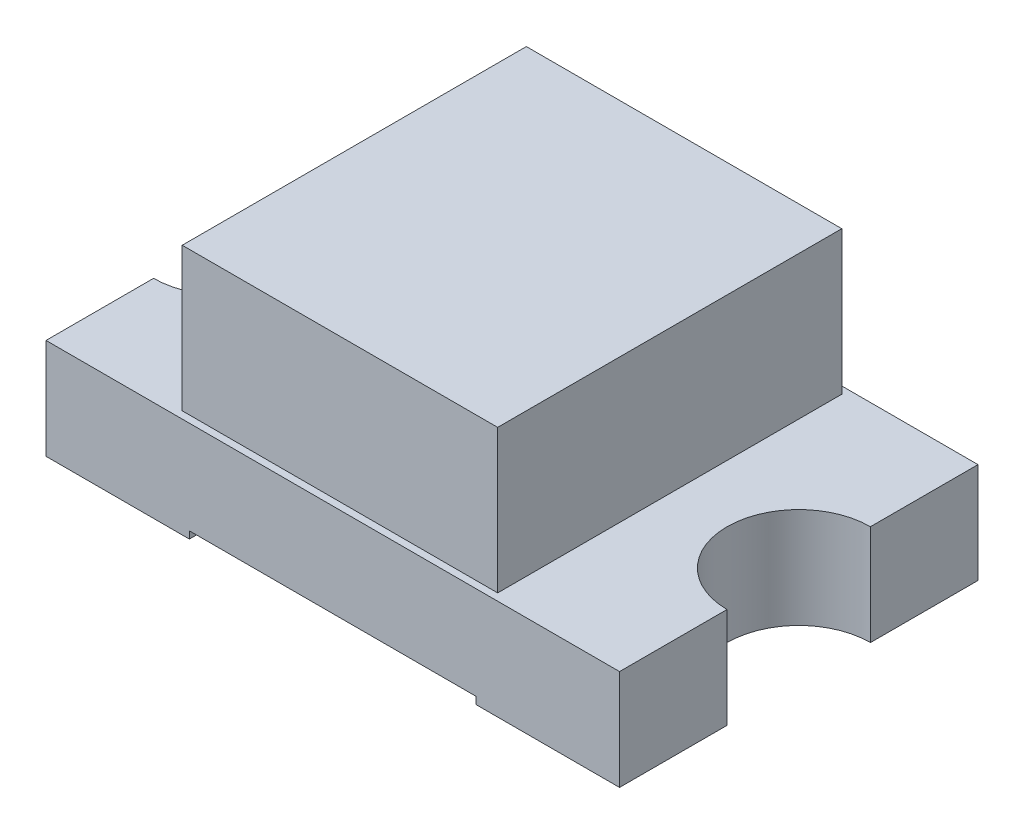
ISO-10303-21;
HEADER;
FILE_DESCRIPTION(('STEP AP214'),'2;1');
FILE_NAME('part.step','',(''),(''),'','','');
FILE_SCHEMA(('AUTOMOTIVE_DESIGN { 1 0 10303 214 1 1 1 1 }'));
ENDSEC;
DATA;
#1=APPLICATION_CONTEXT('core data for automotive mechanical design processes');
#2=APPLICATION_PROTOCOL_DEFINITION('international standard','automotive_design',2000,#1);
#3=PRODUCT_CONTEXT('',#1,'mechanical');
#4=PRODUCT('Part','Part','',(#3));
#5=PRODUCT_RELATED_PRODUCT_CATEGORY('part','',(#4));
#6=PRODUCT_DEFINITION_FORMATION('','',#4);
#7=PRODUCT_DEFINITION_CONTEXT('part definition',#1,'design');
#8=PRODUCT_DEFINITION('design','',#6,#7);
#9=PRODUCT_DEFINITION_SHAPE('','',#8);
#10=(LENGTH_UNIT() NAMED_UNIT(*) SI_UNIT(.MILLI.,.METRE.));
#11=(NAMED_UNIT(*) PLANE_ANGLE_UNIT() SI_UNIT($,.RADIAN.));
#12=(NAMED_UNIT(*) SI_UNIT($,.STERADIAN.) SOLID_ANGLE_UNIT());
#13=UNCERTAINTY_MEASURE_WITH_UNIT(LENGTH_MEASURE(1.E-05),#10,'distance_accuracy_value','');
#14=(GEOMETRIC_REPRESENTATION_CONTEXT(3) GLOBAL_UNCERTAINTY_ASSIGNED_CONTEXT((#13)) GLOBAL_UNIT_ASSIGNED_CONTEXT((#10,
#11,#12)) REPRESENTATION_CONTEXT('',''));
#15=CARTESIAN_POINT('',(0.,0.,0.));
#16=DIRECTION('',(0.,0.,1.));
#17=DIRECTION('',(1.,0.,0.));
#18=AXIS2_PLACEMENT_3D('',#15,#16,#17);
#19=CARTESIAN_POINT('',(0.,0.3302,0.));
#20=DIRECTION('',(0.,1.,0.));
#21=DIRECTION('',(0.,0.,1.));
#22=AXIS2_PLACEMENT_3D('',#19,#20,#21);
#23=PLANE('',#22);
#24=CARTESIAN_POINT('',(0.,0.3302,-0.635));
#25=DIRECTION('',(0.,1.,0.));
#26=DIRECTION('',(0.,0.,1.));
#27=AXIS2_PLACEMENT_3D('',#24,#25,#26);
#28=CIRCLE('',#27,0.254);
#29=CARTESIAN_POINT('',(0.,0.3302,-0.889));
#30=VERTEX_POINT('',#29);
#31=CARTESIAN_POINT('',(0.,0.3302,-0.381));
#32=VERTEX_POINT('',#31);
#33=EDGE_CURVE('E278',#30,#32,#28,.T.);
#34=ORIENTED_EDGE('',*,*,#33,.F.);
#35=DIRECTION('',(0.,0.,1.));
#36=VECTOR('',#35,1.);
#37=CARTESIAN_POINT('',(0.,0.3302,0.));
#38=LINE('',#37,#36);
#39=CARTESIAN_POINT('',(0.,0.3302,-1.27));
#40=VERTEX_POINT('',#39);
#41=EDGE_CURVE('E301',#40,#30,#38,.T.);
#42=ORIENTED_EDGE('',*,*,#41,.F.);
#43=DIRECTION('',(1.,0.,0.));
#44=VECTOR('',#43,1.);
#45=CARTESIAN_POINT('',(0.,0.3302,-1.27));
#46=LINE('',#45,#44);
#47=CARTESIAN_POINT('',(-2.032,0.3302,-1.27));
#48=VERTEX_POINT('',#47);
#49=EDGE_CURVE('E325',#48,#40,#46,.T.);
#50=ORIENTED_EDGE('',*,*,#49,.F.);
#51=DIRECTION('',(0.,0.,1.));
#52=VECTOR('',#51,1.);
#53=CARTESIAN_POINT('',(-2.032,0.3302,0.));
#54=LINE('',#53,#52);
#55=CARTESIAN_POINT('',(-2.032,0.3302,-0.889));
#56=VERTEX_POINT('',#55);
#57=EDGE_CURVE('E348',#48,#56,#54,.T.);
#58=ORIENTED_EDGE('',*,*,#57,.T.);
#59=CARTESIAN_POINT('',(-2.032,0.3302,-0.635));
#60=DIRECTION('',(0.,1.,0.));
#61=DIRECTION('',(0.,0.,1.));
#62=AXIS2_PLACEMENT_3D('',#59,#60,#61);
#63=CIRCLE('',#62,0.254);
#64=CARTESIAN_POINT('',(-2.032,0.3302,-0.381));
#65=VERTEX_POINT('',#64);
#66=EDGE_CURVE('E349',#65,#56,#63,.T.);
#67=ORIENTED_EDGE('',*,*,#66,.F.);
#68=CARTESIAN_POINT('',(-2.032,0.3302,0.));
#69=VERTEX_POINT('',#68);
#70=EDGE_CURVE('E346',#65,#69,#54,.T.);
#71=ORIENTED_EDGE('',*,*,#70,.T.);
#72=DIRECTION('',(1.,0.,0.));
#73=VECTOR('',#72,1.);
#74=CARTESIAN_POINT('',(0.,0.3302,0.));
#75=LINE('',#74,#73);
#76=CARTESIAN_POINT('',(0.,0.3302,0.));
#77=VERTEX_POINT('',#76);
#78=EDGE_CURVE('E343',#69,#77,#75,.T.);
#79=ORIENTED_EDGE('',*,*,#78,.T.);
#80=EDGE_CURVE('E311',#32,#77,#38,.T.);
#81=ORIENTED_EDGE('',*,*,#80,.F.);
#82=EDGE_LOOP('',(#34,#42,#50,#58,#67,#71,#79,#81));
#83=FACE_BOUND('',#82,.T.);
#84=DIRECTION('',(1.,0.,0.));
#85=VECTOR('',#84,1.);
#86=CARTESIAN_POINT('',(0.,0.3302,-0.0254));
#87=LINE('',#86,#85);
#88=CARTESIAN_POINT('',(-1.5748,0.3302,-0.0254));
#89=VERTEX_POINT('',#88);
#90=CARTESIAN_POINT('',(-0.4572,0.3302,-0.0254));
#91=VERTEX_POINT('',#90);
#92=EDGE_CURVE('E54',#89,#91,#87,.T.);
#93=ORIENTED_EDGE('',*,*,#92,.F.);
#94=DIRECTION('',(0.,0.,1.));
#95=VECTOR('',#94,1.);
#96=CARTESIAN_POINT('',(-1.5748,0.3302,0.));
#97=LINE('',#96,#95);
#98=CARTESIAN_POINT('',(-1.5748,0.3302,-1.2446));
#99=VERTEX_POINT('',#98);
#100=EDGE_CURVE('E196',#99,#89,#97,.T.);
#101=ORIENTED_EDGE('',*,*,#100,.F.);
#102=DIRECTION('',(1.,0.,0.));
#103=VECTOR('',#102,1.);
#104=CARTESIAN_POINT('',(0.,0.3302,-1.2446));
#105=LINE('',#104,#103);
#106=CARTESIAN_POINT('',(-0.4572,0.3302,-1.2446));
#107=VERTEX_POINT('',#106);
#108=EDGE_CURVE('E193',#99,#107,#105,.T.);
#109=ORIENTED_EDGE('',*,*,#108,.T.);
#110=DIRECTION('',(0.,0.,1.));
#111=VECTOR('',#110,1.);
#112=CARTESIAN_POINT('',(-0.4572,0.3302,0.));
#113=LINE('',#112,#111);
#114=EDGE_CURVE('E59',#107,#91,#113,.T.);
#115=ORIENTED_EDGE('',*,*,#114,.T.);
#116=EDGE_LOOP('',(#93,#101,#109,#115));
#117=FACE_BOUND('',#116,.T.);
#118=ADVANCED_FACE('F37',(#83,#117),#23,.T.);
#119=CARTESIAN_POINT('',(0.,0.,0.));
#120=DIRECTION('',(0.,1.,0.));
#121=DIRECTION('',(0.,0.,1.));
#122=AXIS2_PLACEMENT_3D('',#119,#120,#121);
#123=PLANE('',#122);
#124=DIRECTION('',(0.,0.,-1.));
#125=VECTOR('',#124,1.);
#126=CARTESIAN_POINT('',(-0.508,0.,0.));
#127=LINE('',#126,#125);
#128=CARTESIAN_POINT('',(-0.508,0.,-0.8509));
#129=VERTEX_POINT('',#128);
#130=CARTESIAN_POINT('',(-0.508,0.,-1.27));
#131=VERTEX_POINT('',#130);
#132=EDGE_CURVE('E236',#129,#131,#127,.T.);
#133=ORIENTED_EDGE('',*,*,#132,.F.);
#134=DIRECTION('',(-1.,0.,0.));
#135=VECTOR('',#134,1.);
#136=CARTESIAN_POINT('',(0.,0.,-0.8509));
#137=LINE('',#136,#135);
#138=CARTESIAN_POINT('',(-0.9398,0.,-0.8509));
#139=VERTEX_POINT('',#138);
#140=EDGE_CURVE('E234',#129,#139,#137,.T.);
#141=ORIENTED_EDGE('',*,*,#140,.T.);
#142=DIRECTION('',(0.,0.,-1.));
#143=VECTOR('',#142,1.);
#144=CARTESIAN_POINT('',(-0.9398,0.,0.));
#145=LINE('',#144,#143);
#146=CARTESIAN_POINT('',(-0.9398,0.,-0.4191));
#147=VERTEX_POINT('',#146);
#148=EDGE_CURVE('E200',#147,#139,#145,.T.);
#149=ORIENTED_EDGE('',*,*,#148,.F.);
#150=DIRECTION('',(-1.,0.,0.));
#151=VECTOR('',#150,1.);
#152=CARTESIAN_POINT('',(0.,0.,-0.419099999999999));
#153=LINE('',#152,#151);
#154=CARTESIAN_POINT('',(-0.508,0.,-0.4191));
#155=VERTEX_POINT('',#154);
#156=EDGE_CURVE('E197',#155,#147,#153,.T.);
#157=ORIENTED_EDGE('',*,*,#156,.F.);
#158=CARTESIAN_POINT('',(-0.508,0.,0.));
#159=VERTEX_POINT('',#158);
#160=EDGE_CURVE('E210',#159,#155,#127,.T.);
#161=ORIENTED_EDGE('',*,*,#160,.F.);
#162=DIRECTION('',(1.,0.,0.));
#163=VECTOR('',#162,1.);
#164=CARTESIAN_POINT('',(0.,0.,0.));
#165=LINE('',#164,#163);
#166=CARTESIAN_POINT('',(-1.524,0.,0.));
#167=VERTEX_POINT('',#166);
#168=EDGE_CURVE('E294',#167,#159,#165,.T.);
#169=ORIENTED_EDGE('',*,*,#168,.F.);
#170=DIRECTION('',(0.,0.,1.));
#171=VECTOR('',#170,1.);
#172=CARTESIAN_POINT('',(-1.524,0.,0.));
#173=LINE('',#172,#171);
#174=CARTESIAN_POINT('',(-1.524,0.,-1.27));
#175=VERTEX_POINT('',#174);
#176=EDGE_CURVE('E257',#175,#167,#173,.T.);
#177=ORIENTED_EDGE('',*,*,#176,.F.);
#178=DIRECTION('',(1.,0.,0.));
#179=VECTOR('',#178,1.);
#180=CARTESIAN_POINT('',(0.,0.,-1.27));
#181=LINE('',#180,#179);
#182=EDGE_CURVE('E284',#175,#131,#181,.T.);
#183=ORIENTED_EDGE('',*,*,#182,.T.);
#184=EDGE_LOOP('',(#133,#141,#149,#157,#161,#169,#177,#183));
#185=FACE_BOUND('',#184,.T.);
#186=ADVANCED_FACE('F394',(#185),#123,.F.);
#187=CARTESIAN_POINT('',(0.,0.3302,-0.635));
#188=DIRECTION('',(0.,-1.,0.));
#189=DIRECTION('',(0.,0.,-1.));
#190=AXIS2_PLACEMENT_3D('',#187,#188,#189);
#191=CYLINDRICAL_SURFACE('',#190,0.254);
#192=DIRECTION('',(0.,-1.,0.));
#193=VECTOR('',#192,1.);
#194=CARTESIAN_POINT('',(0.,0.3302,-0.381));
#195=LINE('',#194,#193);
#196=CARTESIAN_POINT('',(0.,-0.0254,-0.381));
#197=VERTEX_POINT('',#196);
#198=EDGE_CURVE('E308',#32,#197,#195,.T.);
#199=ORIENTED_EDGE('',*,*,#198,.T.);
#200=CARTESIAN_POINT('',(0.,-0.0254,-0.635));
#201=DIRECTION('',(0.,-1.,0.));
#202=DIRECTION('',(0.,0.,-1.));
#203=AXIS2_PLACEMENT_3D('',#200,#201,#202);
#204=CIRCLE('',#203,0.254);
#205=CARTESIAN_POINT('',(0.,-0.0254,-0.889));
#206=VERTEX_POINT('',#205);
#207=EDGE_CURVE('E224',#206,#197,#204,.F.);
#208=ORIENTED_EDGE('',*,*,#207,.F.);
#209=DIRECTION('',(0.,-1.,0.));
#210=VECTOR('',#209,1.);
#211=CARTESIAN_POINT('',(0.,0.3302,-0.889));
#212=LINE('',#211,#210);
#213=EDGE_CURVE('E11',#30,#206,#212,.T.);
#214=ORIENTED_EDGE('',*,*,#213,.F.);
#215=ORIENTED_EDGE('',*,*,#33,.T.);
#216=EDGE_LOOP('',(#199,#208,#214,#215));
#217=FACE_BOUND('',#216,.T.);
#218=ADVANCED_FACE('F39',(#217),#191,.F.);
#219=CARTESIAN_POINT('',(0.,0.3302,0.));
#220=DIRECTION('',(1.,0.,0.));
#221=DIRECTION('',(0.,0.,-1.));
#222=AXIS2_PLACEMENT_3D('',#219,#220,#221);
#223=PLANE('',#222);
#224=ORIENTED_EDGE('',*,*,#213,.T.);
#225=DIRECTION('',(0.,0.,1.));
#226=VECTOR('',#225,1.);
#227=CARTESIAN_POINT('',(0.,-0.0254,0.));
#228=LINE('',#227,#226);
#229=CARTESIAN_POINT('',(0.,-0.0254,-1.27));
#230=VERTEX_POINT('',#229);
#231=EDGE_CURVE('E221',#230,#206,#228,.T.);
#232=ORIENTED_EDGE('',*,*,#231,.F.);
#233=DIRECTION('',(0.,-1.,0.));
#234=VECTOR('',#233,1.);
#235=CARTESIAN_POINT('',(0.,0.3302,-1.27));
#236=LINE('',#235,#234);
#237=EDGE_CURVE('E46',#40,#230,#236,.T.);
#238=ORIENTED_EDGE('',*,*,#237,.F.);
#239=ORIENTED_EDGE('',*,*,#41,.T.);
#240=EDGE_LOOP('',(#224,#232,#238,#239));
#241=FACE_BOUND('',#240,.T.);
#242=ADVANCED_FACE('F336',(#241),#223,.T.);
#243=CARTESIAN_POINT('',(0.,0.3302,-1.27));
#244=DIRECTION('',(0.,0.,-1.));
#245=DIRECTION('',(-1.,0.,0.));
#246=AXIS2_PLACEMENT_3D('',#243,#244,#245);
#247=PLANE('',#246);
#248=ORIENTED_EDGE('',*,*,#182,.F.);
#249=DIRECTION('',(0.,1.,0.));
#250=VECTOR('',#249,1.);
#251=CARTESIAN_POINT('',(-1.524,-0.0254,-1.27));
#252=LINE('',#251,#250);
#253=CARTESIAN_POINT('',(-1.524,-0.0254,-1.27));
#254=VERTEX_POINT('',#253);
#255=EDGE_CURVE('E289',#254,#175,#252,.T.);
#256=ORIENTED_EDGE('',*,*,#255,.F.);
#257=DIRECTION('',(1.,0.,0.));
#258=VECTOR('',#257,1.);
#259=CARTESIAN_POINT('',(0.,-0.0254,-1.27));
#260=LINE('',#259,#258);
#261=CARTESIAN_POINT('',(-2.032,-0.0254,-1.27));
#262=VERTEX_POINT('',#261);
#263=EDGE_CURVE('E258',#262,#254,#260,.T.);
#264=ORIENTED_EDGE('',*,*,#263,.F.);
#265=DIRECTION('',(0.,-1.,0.));
#266=VECTOR('',#265,1.);
#267=CARTESIAN_POINT('',(-2.032,0.3302,-1.27));
#268=LINE('',#267,#266);
#269=EDGE_CURVE('E319',#48,#262,#268,.T.);
#270=ORIENTED_EDGE('',*,*,#269,.F.);
#271=ORIENTED_EDGE('',*,*,#49,.T.);
#272=ORIENTED_EDGE('',*,*,#237,.T.);
#273=DIRECTION('',(1.,0.,0.));
#274=VECTOR('',#273,1.);
#275=CARTESIAN_POINT('',(0.,-0.0254,-1.27));
#276=LINE('',#275,#274);
#277=CARTESIAN_POINT('',(-0.508,-0.0254,-1.27));
#278=VERTEX_POINT('',#277);
#279=EDGE_CURVE('E217',#278,#230,#276,.T.);
#280=ORIENTED_EDGE('',*,*,#279,.F.);
#281=DIRECTION('',(0.,1.,0.));
#282=VECTOR('',#281,1.);
#283=CARTESIAN_POINT('',(-0.508,-0.0254,-1.27));
#284=LINE('',#283,#282);
#285=EDGE_CURVE('E245',#278,#131,#284,.T.);
#286=ORIENTED_EDGE('',*,*,#285,.T.);
#287=EDGE_LOOP('',(#248,#256,#264,#270,#271,#272,#280,#286));
#288=FACE_BOUND('',#287,.T.);
#289=ADVANCED_FACE('F323',(#288),#247,.T.);
#290=CARTESIAN_POINT('',(-2.032,0.3302,0.));
#291=DIRECTION('',(1.,0.,0.));
#292=DIRECTION('',(0.,0.,-1.));
#293=AXIS2_PLACEMENT_3D('',#290,#291,#292);
#294=PLANE('',#293);
#295=ORIENTED_EDGE('',*,*,#269,.T.);
#296=DIRECTION('',(0.,0.,-1.));
#297=VECTOR('',#296,1.);
#298=CARTESIAN_POINT('',(-2.032,-0.0254,0.));
#299=LINE('',#298,#297);
#300=CARTESIAN_POINT('',(-2.032,-0.0254,-0.889));
#301=VERTEX_POINT('',#300);
#302=EDGE_CURVE('E272',#301,#262,#299,.T.);
#303=ORIENTED_EDGE('',*,*,#302,.F.);
#304=DIRECTION('',(0.,-1.,0.));
#305=VECTOR('',#304,1.);
#306=CARTESIAN_POINT('',(-2.032,0.3302,-0.889));
#307=LINE('',#306,#305);
#308=EDGE_CURVE('E317',#56,#301,#307,.T.);
#309=ORIENTED_EDGE('',*,*,#308,.F.);
#310=ORIENTED_EDGE('',*,*,#57,.F.);
#311=EDGE_LOOP('',(#295,#303,#309,#310));
#312=FACE_BOUND('',#311,.T.);
#313=ADVANCED_FACE('F391',(#312),#294,.F.);
#314=CARTESIAN_POINT('',(-2.032,0.3302,-0.635));
#315=DIRECTION('',(0.,-1.,0.));
#316=DIRECTION('',(0.,0.,-1.));
#317=AXIS2_PLACEMENT_3D('',#314,#315,#316);
#318=CYLINDRICAL_SURFACE('',#317,0.254);
#319=ORIENTED_EDGE('',*,*,#308,.T.);
#320=CARTESIAN_POINT('',(-2.032,-0.0254,-0.635));
#321=DIRECTION('',(0.,-1.,0.));
#322=DIRECTION('',(0.,0.,-1.));
#323=AXIS2_PLACEMENT_3D('',#320,#321,#322);
#324=CIRCLE('',#323,0.254);
#325=CARTESIAN_POINT('',(-2.032,-0.0254,-0.381));
#326=VERTEX_POINT('',#325);
#327=EDGE_CURVE('E269',#326,#301,#324,.F.);
#328=ORIENTED_EDGE('',*,*,#327,.F.);
#329=DIRECTION('',(0.,-1.,0.));
#330=VECTOR('',#329,1.);
#331=CARTESIAN_POINT('',(-2.032,0.3302,-0.381));
#332=LINE('',#331,#330);
#333=EDGE_CURVE('E315',#65,#326,#332,.T.);
#334=ORIENTED_EDGE('',*,*,#333,.F.);
#335=ORIENTED_EDGE('',*,*,#66,.T.);
#336=EDGE_LOOP('',(#319,#328,#334,#335));
#337=FACE_BOUND('',#336,.T.);
#338=ADVANCED_FACE('F392',(#337),#318,.F.);
#339=ORIENTED_EDGE('',*,*,#333,.T.);
#340=DIRECTION('',(0.,0.,-1.));
#341=VECTOR('',#340,1.);
#342=CARTESIAN_POINT('',(-2.032,-0.0254,0.));
#343=LINE('',#342,#341);
#344=CARTESIAN_POINT('',(-2.032,-0.0254,0.));
#345=VERTEX_POINT('',#344);
#346=EDGE_CURVE('E266',#345,#326,#343,.T.);
#347=ORIENTED_EDGE('',*,*,#346,.F.);
#348=DIRECTION('',(0.,-1.,0.));
#349=VECTOR('',#348,1.);
#350=CARTESIAN_POINT('',(-2.032,0.3302,0.));
#351=LINE('',#350,#349);
#352=EDGE_CURVE('E313',#69,#345,#351,.T.);
#353=ORIENTED_EDGE('',*,*,#352,.F.);
#354=ORIENTED_EDGE('',*,*,#70,.F.);
#355=EDGE_LOOP('',(#339,#347,#353,#354));
#356=FACE_BOUND('',#355,.T.);
#357=ADVANCED_FACE('F359',(#356),#294,.F.);
#358=CARTESIAN_POINT('',(0.,0.3302,0.));
#359=DIRECTION('',(0.,0.,-1.));
#360=DIRECTION('',(-1.,0.,0.));
#361=AXIS2_PLACEMENT_3D('',#358,#359,#360);
#362=PLANE('',#361);
#363=ORIENTED_EDGE('',*,*,#352,.T.);
#364=DIRECTION('',(-1.,0.,0.));
#365=VECTOR('',#364,1.);
#366=CARTESIAN_POINT('',(0.,-0.0254,0.));
#367=LINE('',#366,#365);
#368=CARTESIAN_POINT('',(-1.524,-0.0254,0.));
#369=VERTEX_POINT('',#368);
#370=EDGE_CURVE('E263',#369,#345,#367,.T.);
#371=ORIENTED_EDGE('',*,*,#370,.F.);
#372=DIRECTION('',(0.,1.,0.));
#373=VECTOR('',#372,1.);
#374=CARTESIAN_POINT('',(-1.524,-0.0254,0.));
#375=LINE('',#374,#373);
#376=EDGE_CURVE('E275',#369,#167,#375,.T.);
#377=ORIENTED_EDGE('',*,*,#376,.T.);
#378=ORIENTED_EDGE('',*,*,#168,.T.);
#379=DIRECTION('',(0.,1.,0.));
#380=VECTOR('',#379,1.);
#381=CARTESIAN_POINT('',(-0.508,-0.0254,0.));
#382=LINE('',#381,#380);
#383=CARTESIAN_POINT('',(-0.508,-0.0254,0.));
#384=VERTEX_POINT('',#383);
#385=EDGE_CURVE('E242',#384,#159,#382,.T.);
#386=ORIENTED_EDGE('',*,*,#385,.F.);
#387=DIRECTION('',(-1.,0.,0.));
#388=VECTOR('',#387,1.);
#389=CARTESIAN_POINT('',(0.,-0.0254,0.));
#390=LINE('',#389,#388);
#391=CARTESIAN_POINT('',(0.,-0.0254,0.));
#392=VERTEX_POINT('',#391);
#393=EDGE_CURVE('E230',#392,#384,#390,.T.);
#394=ORIENTED_EDGE('',*,*,#393,.F.);
#395=DIRECTION('',(0.,-1.,0.));
#396=VECTOR('',#395,1.);
#397=CARTESIAN_POINT('',(0.,0.3302,0.));
#398=LINE('',#397,#396);
#399=EDGE_CURVE('E310',#77,#392,#398,.T.);
#400=ORIENTED_EDGE('',*,*,#399,.F.);
#401=ORIENTED_EDGE('',*,*,#78,.F.);
#402=EDGE_LOOP('',(#363,#371,#377,#378,#386,#394,#400,#401));
#403=FACE_BOUND('',#402,.T.);
#404=ADVANCED_FACE('F361',(#403),#362,.F.);
#405=ORIENTED_EDGE('',*,*,#399,.T.);
#406=DIRECTION('',(0.,0.,1.));
#407=VECTOR('',#406,1.);
#408=CARTESIAN_POINT('',(0.,-0.0254,0.));
#409=LINE('',#408,#407);
#410=EDGE_CURVE('E227',#197,#392,#409,.T.);
#411=ORIENTED_EDGE('',*,*,#410,.F.);
#412=ORIENTED_EDGE('',*,*,#198,.F.);
#413=ORIENTED_EDGE('',*,*,#80,.T.);
#414=EDGE_LOOP('',(#405,#411,#412,#413));
#415=FACE_BOUND('',#414,.T.);
#416=ADVANCED_FACE('F364',(#415),#223,.T.);
#417=CARTESIAN_POINT('',(-1.524,-0.0254,0.));
#418=DIRECTION('',(-1.,0.,0.));
#419=DIRECTION('',(0.,0.,1.));
#420=AXIS2_PLACEMENT_3D('',#417,#418,#419);
#421=PLANE('',#420);
#422=ORIENTED_EDGE('',*,*,#176,.T.);
#423=ORIENTED_EDGE('',*,*,#376,.F.);
#424=DIRECTION('',(0.,0.,1.));
#425=VECTOR('',#424,1.);
#426=CARTESIAN_POINT('',(-1.524,-0.0254,0.));
#427=LINE('',#426,#425);
#428=EDGE_CURVE('E261',#254,#369,#427,.T.);
#429=ORIENTED_EDGE('',*,*,#428,.F.);
#430=ORIENTED_EDGE('',*,*,#255,.T.);
#431=EDGE_LOOP('',(#422,#423,#429,#430));
#432=FACE_BOUND('',#431,.T.);
#433=ADVANCED_FACE('F393',(#432),#421,.F.);
#434=CARTESIAN_POINT('',(0.,-0.0254,0.));
#435=DIRECTION('',(0.,-1.,0.));
#436=DIRECTION('',(0.,0.,-1.));
#437=AXIS2_PLACEMENT_3D('',#434,#435,#436);
#438=PLANE('',#437);
#439=ORIENTED_EDGE('',*,*,#263,.T.);
#440=ORIENTED_EDGE('',*,*,#428,.T.);
#441=ORIENTED_EDGE('',*,*,#370,.T.);
#442=ORIENTED_EDGE('',*,*,#346,.T.);
#443=ORIENTED_EDGE('',*,*,#327,.T.);
#444=ORIENTED_EDGE('',*,*,#302,.T.);
#445=EDGE_LOOP('',(#439,#440,#441,#442,#443,#444));
#446=FACE_BOUND('',#445,.T.);
#447=ADVANCED_FACE('F385',(#446),#438,.T.);
#448=CARTESIAN_POINT('',(0.,-0.0254,-0.419099999999999));
#449=DIRECTION('',(0.,0.,-1.));
#450=DIRECTION('',(-1.,0.,0.));
#451=AXIS2_PLACEMENT_3D('',#448,#449,#450);
#452=PLANE('',#451);
#453=ORIENTED_EDGE('',*,*,#156,.T.);
#454=DIRECTION('',(0.,1.,0.));
#455=VECTOR('',#454,1.);
#456=CARTESIAN_POINT('',(-0.9398,-0.0254,-0.4191));
#457=LINE('',#456,#455);
#458=CARTESIAN_POINT('',(-0.9398,-0.0254,-0.4191));
#459=VERTEX_POINT('',#458);
#460=EDGE_CURVE('E254',#459,#147,#457,.T.);
#461=ORIENTED_EDGE('',*,*,#460,.F.);
#462=DIRECTION('',(-1.,0.,0.));
#463=VECTOR('',#462,1.);
#464=CARTESIAN_POINT('',(0.,-0.0254,-0.419099999999999));
#465=LINE('',#464,#463);
#466=CARTESIAN_POINT('',(-0.508,-0.0254,-0.4191));
#467=VERTEX_POINT('',#466);
#468=EDGE_CURVE('E206',#467,#459,#465,.T.);
#469=ORIENTED_EDGE('',*,*,#468,.F.);
#470=DIRECTION('',(0.,1.,0.));
#471=VECTOR('',#470,1.);
#472=CARTESIAN_POINT('',(-0.508,-0.0254,-0.4191));
#473=LINE('',#472,#471);
#474=EDGE_CURVE('E239',#467,#155,#473,.T.);
#475=ORIENTED_EDGE('',*,*,#474,.T.);
#476=EDGE_LOOP('',(#453,#461,#469,#475));
#477=FACE_BOUND('',#476,.T.);
#478=ADVANCED_FACE('F373',(#477),#452,.F.);
#479=CARTESIAN_POINT('',(-0.9398,-0.0254,0.));
#480=DIRECTION('',(1.,0.,0.));
#481=DIRECTION('',(0.,0.,-1.));
#482=AXIS2_PLACEMENT_3D('',#479,#480,#481);
#483=PLANE('',#482);
#484=ORIENTED_EDGE('',*,*,#148,.T.);
#485=DIRECTION('',(0.,1.,0.));
#486=VECTOR('',#485,1.);
#487=CARTESIAN_POINT('',(-0.9398,-0.0254,-0.8509));
#488=LINE('',#487,#486);
#489=CARTESIAN_POINT('',(-0.9398,-0.0254,-0.8509));
#490=VERTEX_POINT('',#489);
#491=EDGE_CURVE('E251',#490,#139,#488,.T.);
#492=ORIENTED_EDGE('',*,*,#491,.F.);
#493=DIRECTION('',(0.,0.,-1.));
#494=VECTOR('',#493,1.);
#495=CARTESIAN_POINT('',(-0.9398,-0.0254,0.));
#496=LINE('',#495,#494);
#497=EDGE_CURVE('E209',#459,#490,#496,.T.);
#498=ORIENTED_EDGE('',*,*,#497,.F.);
#499=ORIENTED_EDGE('',*,*,#460,.T.);
#500=EDGE_LOOP('',(#484,#492,#498,#499));
#501=FACE_BOUND('',#500,.T.);
#502=ADVANCED_FACE('F376',(#501),#483,.F.);
#503=CARTESIAN_POINT('',(0.,-0.0254,-0.8509));
#504=DIRECTION('',(0.,0.,-1.));
#505=DIRECTION('',(-1.,0.,0.));
#506=AXIS2_PLACEMENT_3D('',#503,#504,#505);
#507=PLANE('',#506);
#508=ORIENTED_EDGE('',*,*,#140,.F.);
#509=DIRECTION('',(0.,1.,0.));
#510=VECTOR('',#509,1.);
#511=CARTESIAN_POINT('',(-0.508,-0.0254,-0.8509));
#512=LINE('',#511,#510);
#513=CARTESIAN_POINT('',(-0.508,-0.0254,-0.8509));
#514=VERTEX_POINT('',#513);
#515=EDGE_CURVE('E248',#514,#129,#512,.T.);
#516=ORIENTED_EDGE('',*,*,#515,.F.);
#517=DIRECTION('',(-1.,0.,0.));
#518=VECTOR('',#517,1.);
#519=CARTESIAN_POINT('',(0.,-0.0254,-0.8509));
#520=LINE('',#519,#518);
#521=EDGE_CURVE('E212',#514,#490,#520,.T.);
#522=ORIENTED_EDGE('',*,*,#521,.T.);
#523=ORIENTED_EDGE('',*,*,#491,.T.);
#524=EDGE_LOOP('',(#508,#516,#522,#523));
#525=FACE_BOUND('',#524,.T.);
#526=ADVANCED_FACE('F379',(#525),#507,.T.);
#527=CARTESIAN_POINT('',(-0.508,-0.0254,0.));
#528=DIRECTION('',(1.,0.,0.));
#529=DIRECTION('',(0.,0.,-1.));
#530=AXIS2_PLACEMENT_3D('',#527,#528,#529);
#531=PLANE('',#530);
#532=ORIENTED_EDGE('',*,*,#132,.T.);
#533=ORIENTED_EDGE('',*,*,#285,.F.);
#534=DIRECTION('',(0.,0.,-1.));
#535=VECTOR('',#534,1.);
#536=CARTESIAN_POINT('',(-0.508,-0.0254,0.));
#537=LINE('',#536,#535);
#538=EDGE_CURVE('E215',#514,#278,#537,.T.);
#539=ORIENTED_EDGE('',*,*,#538,.F.);
#540=ORIENTED_EDGE('',*,*,#515,.T.);
#541=EDGE_LOOP('',(#532,#533,#539,#540));
#542=FACE_BOUND('',#541,.T.);
#543=ADVANCED_FACE('F381',(#542),#531,.F.);
#544=ORIENTED_EDGE('',*,*,#160,.T.);
#545=ORIENTED_EDGE('',*,*,#474,.F.);
#546=EDGE_CURVE('E218',#384,#467,#537,.T.);
#547=ORIENTED_EDGE('',*,*,#546,.F.);
#548=ORIENTED_EDGE('',*,*,#385,.T.);
#549=EDGE_LOOP('',(#544,#545,#547,#548));
#550=FACE_BOUND('',#549,.T.);
#551=ADVANCED_FACE('F369',(#550),#531,.F.);
#552=CARTESIAN_POINT('',(0.,-0.0254,0.));
#553=DIRECTION('',(0.,-1.,0.));
#554=DIRECTION('',(0.,0.,-1.));
#555=AXIS2_PLACEMENT_3D('',#552,#553,#554);
#556=PLANE('',#555);
#557=ORIENTED_EDGE('',*,*,#468,.T.);
#558=ORIENTED_EDGE('',*,*,#497,.T.);
#559=ORIENTED_EDGE('',*,*,#521,.F.);
#560=ORIENTED_EDGE('',*,*,#538,.T.);
#561=ORIENTED_EDGE('',*,*,#279,.T.);
#562=ORIENTED_EDGE('',*,*,#231,.T.);
#563=ORIENTED_EDGE('',*,*,#207,.T.);
#564=ORIENTED_EDGE('',*,*,#410,.T.);
#565=ORIENTED_EDGE('',*,*,#393,.T.);
#566=ORIENTED_EDGE('',*,*,#546,.T.);
#567=EDGE_LOOP('',(#557,#558,#559,#560,#561,#562,#563,#564,#565,#566));
#568=FACE_BOUND('',#567,.T.);
#569=ADVANCED_FACE('F331',(#568),#556,.T.);
#570=CARTESIAN_POINT('',(-1.5748,0.8382,0.));
#571=DIRECTION('',(1.,0.,0.));
#572=DIRECTION('',(0.,0.,-1.));
#573=AXIS2_PLACEMENT_3D('',#570,#571,#572);
#574=PLANE('',#573);
#575=ORIENTED_EDGE('',*,*,#100,.T.);
#576=DIRECTION('',(0.,-1.,0.));
#577=VECTOR('',#576,1.);
#578=CARTESIAN_POINT('',(-1.5748,0.8382,-0.0254));
#579=LINE('',#578,#577);
#580=CARTESIAN_POINT('',(-1.5748,0.8382,-0.0254));
#581=VERTEX_POINT('',#580);
#582=EDGE_CURVE('E177',#581,#89,#579,.T.);
#583=ORIENTED_EDGE('',*,*,#582,.F.);
#584=DIRECTION('',(0.,0.,1.));
#585=VECTOR('',#584,1.);
#586=CARTESIAN_POINT('',(-1.5748,0.8382,0.));
#587=LINE('',#586,#585);
#588=CARTESIAN_POINT('',(-1.5748,0.8382,-1.2446));
#589=VERTEX_POINT('',#588);
#590=EDGE_CURVE('E184',#589,#581,#587,.T.);
#591=ORIENTED_EDGE('',*,*,#590,.F.);
#592=DIRECTION('',(0.,-1.,0.));
#593=VECTOR('',#592,1.);
#594=CARTESIAN_POINT('',(-1.5748,0.8382,-1.2446));
#595=LINE('',#594,#593);
#596=EDGE_CURVE('E632',#589,#99,#595,.T.);
#597=ORIENTED_EDGE('',*,*,#596,.T.);
#598=EDGE_LOOP('',(#575,#583,#591,#597));
#599=FACE_BOUND('',#598,.T.);
#600=ADVANCED_FACE('F195',(#599),#574,.F.);
#601=CARTESIAN_POINT('',(0.,0.8382,-0.0254));
#602=DIRECTION('',(0.,0.,-1.));
#603=DIRECTION('',(-1.,0.,0.));
#604=AXIS2_PLACEMENT_3D('',#601,#602,#603);
#605=PLANE('',#604);
#606=ORIENTED_EDGE('',*,*,#92,.T.);
#607=DIRECTION('',(0.,-1.,0.));
#608=VECTOR('',#607,1.);
#609=CARTESIAN_POINT('',(-0.4572,0.8382,-0.0254));
#610=LINE('',#609,#608);
#611=CARTESIAN_POINT('',(-0.4572,0.8382,-0.0254));
#612=VERTEX_POINT('',#611);
#613=EDGE_CURVE('E179',#612,#91,#610,.T.);
#614=ORIENTED_EDGE('',*,*,#613,.F.);
#615=DIRECTION('',(1.,0.,0.));
#616=VECTOR('',#615,1.);
#617=CARTESIAN_POINT('',(0.,0.8382,-0.0254));
#618=LINE('',#617,#616);
#619=EDGE_CURVE('E173',#581,#612,#618,.T.);
#620=ORIENTED_EDGE('',*,*,#619,.F.);
#621=ORIENTED_EDGE('',*,*,#582,.T.);
#622=EDGE_LOOP('',(#606,#614,#620,#621));
#623=FACE_BOUND('',#622,.T.);
#624=ADVANCED_FACE('F175',(#623),#605,.F.);
#625=CARTESIAN_POINT('',(-0.4572,0.8382,0.));
#626=DIRECTION('',(1.,0.,0.));
#627=DIRECTION('',(0.,0.,-1.));
#628=AXIS2_PLACEMENT_3D('',#625,#626,#627);
#629=PLANE('',#628);
#630=ORIENTED_EDGE('',*,*,#114,.F.);
#631=DIRECTION('',(0.,-1.,0.));
#632=VECTOR('',#631,1.);
#633=CARTESIAN_POINT('',(-0.4572,0.8382,-1.2446));
#634=LINE('',#633,#632);
#635=CARTESIAN_POINT('',(-0.4572,0.8382,-1.2446));
#636=VERTEX_POINT('',#635);
#637=EDGE_CURVE('E202',#636,#107,#634,.T.);
#638=ORIENTED_EDGE('',*,*,#637,.F.);
#639=DIRECTION('',(0.,0.,1.));
#640=VECTOR('',#639,1.);
#641=CARTESIAN_POINT('',(-0.4572,0.8382,0.));
#642=LINE('',#641,#640);
#643=EDGE_CURVE('E183',#636,#612,#642,.T.);
#644=ORIENTED_EDGE('',*,*,#643,.T.);
#645=ORIENTED_EDGE('',*,*,#613,.T.);
#646=EDGE_LOOP('',(#630,#638,#644,#645));
#647=FACE_BOUND('',#646,.T.);
#648=ADVANCED_FACE('F592',(#647),#629,.T.);
#649=CARTESIAN_POINT('',(0.,0.8382,-1.2446));
#650=DIRECTION('',(0.,0.,-1.));
#651=DIRECTION('',(-1.,0.,0.));
#652=AXIS2_PLACEMENT_3D('',#649,#650,#651);
#653=PLANE('',#652);
#654=ORIENTED_EDGE('',*,*,#108,.F.);
#655=ORIENTED_EDGE('',*,*,#596,.F.);
#656=DIRECTION('',(1.,0.,0.));
#657=VECTOR('',#656,1.);
#658=CARTESIAN_POINT('',(0.,0.8382,-1.2446));
#659=LINE('',#658,#657);
#660=EDGE_CURVE('E190',#589,#636,#659,.T.);
#661=ORIENTED_EDGE('',*,*,#660,.T.);
#662=ORIENTED_EDGE('',*,*,#637,.T.);
#663=EDGE_LOOP('',(#654,#655,#661,#662));
#664=FACE_BOUND('',#663,.T.);
#665=ADVANCED_FACE('F602',(#664),#653,.T.);
#666=CARTESIAN_POINT('',(0.,0.8382,0.));
#667=DIRECTION('',(0.,1.,0.));
#668=DIRECTION('',(0.,0.,1.));
#669=AXIS2_PLACEMENT_3D('',#666,#667,#668);
#670=PLANE('',#669);
#671=ORIENTED_EDGE('',*,*,#590,.T.);
#672=ORIENTED_EDGE('',*,*,#619,.T.);
#673=ORIENTED_EDGE('',*,*,#643,.F.);
#674=ORIENTED_EDGE('',*,*,#660,.F.);
#675=EDGE_LOOP('',(#671,#672,#673,#674));
#676=FACE_BOUND('',#675,.T.);
#677=ADVANCED_FACE('F188',(#676),#670,.T.);
#678=CLOSED_SHELL('',(#118,#186,#218,#242,#289,#313,#338,#357,#404,#416,#433,#447,#478,#502,
#526,#543,#551,#569,#600,#624,#648,#665,#677));
#679=MANIFOLD_SOLID_BREP('B2',#678);
#680=ADVANCED_BREP_SHAPE_REPRESENTATION('',(#18,#679),#14);
#681=SHAPE_DEFINITION_REPRESENTATION(#9,#680);
ENDSEC;
END-ISO-10303-21;
